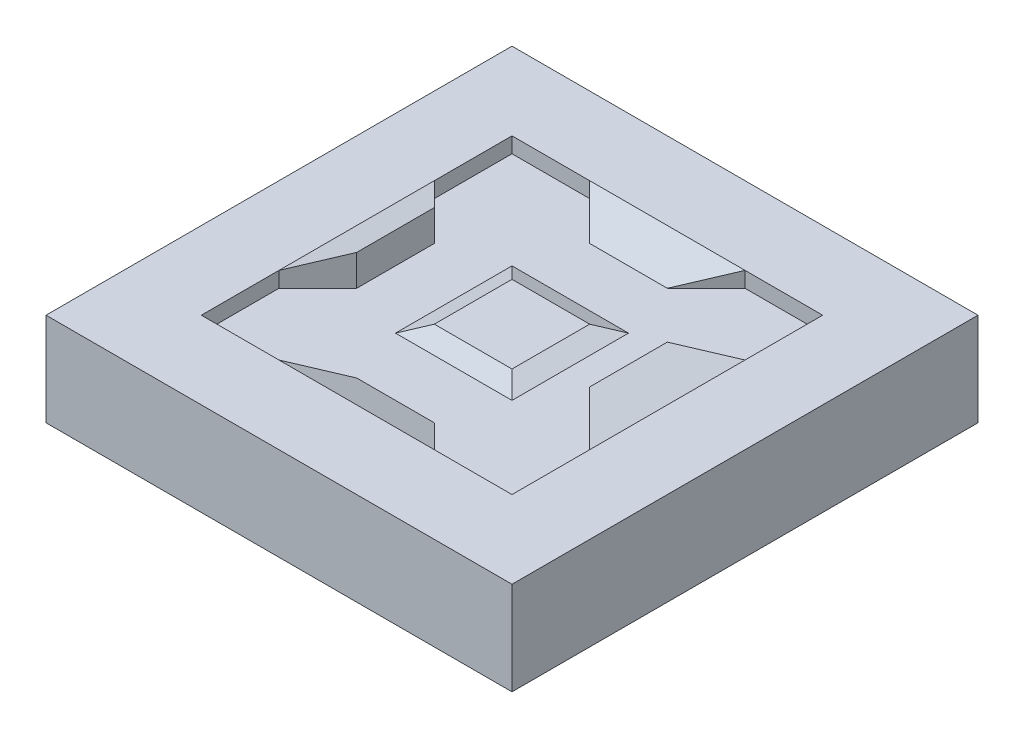
ISO-10303-21;
HEADER;
FILE_DESCRIPTION(('STEP AP214'),'2;1');
FILE_NAME('part.step','',(''),(''),'','','');
FILE_SCHEMA(('AUTOMOTIVE_DESIGN { 1 0 10303 214 1 1 1 1 }'));
ENDSEC;
DATA;
#1=APPLICATION_CONTEXT('core data for automotive mechanical design processes');
#2=APPLICATION_PROTOCOL_DEFINITION('international standard','automotive_design',2000,#1);
#3=PRODUCT_CONTEXT('',#1,'mechanical');
#4=PRODUCT('Part','Part','',(#3));
#5=PRODUCT_RELATED_PRODUCT_CATEGORY('part','',(#4));
#6=PRODUCT_DEFINITION_FORMATION('','',#4);
#7=PRODUCT_DEFINITION_CONTEXT('part definition',#1,'design');
#8=PRODUCT_DEFINITION('design','',#6,#7);
#9=PRODUCT_DEFINITION_SHAPE('','',#8);
#10=(LENGTH_UNIT() NAMED_UNIT(*) SI_UNIT(.MILLI.,.METRE.));
#11=(NAMED_UNIT(*) PLANE_ANGLE_UNIT() SI_UNIT($,.RADIAN.));
#12=(NAMED_UNIT(*) SI_UNIT($,.STERADIAN.) SOLID_ANGLE_UNIT());
#13=UNCERTAINTY_MEASURE_WITH_UNIT(LENGTH_MEASURE(1.E-05),#10,'distance_accuracy_value','');
#14=(GEOMETRIC_REPRESENTATION_CONTEXT(3) GLOBAL_UNCERTAINTY_ASSIGNED_CONTEXT((#13)) GLOBAL_UNIT_ASSIGNED_CONTEXT((#10,
#11,#12)) REPRESENTATION_CONTEXT('',''));
#15=CARTESIAN_POINT('',(0.,0.,0.));
#16=DIRECTION('',(0.,0.,1.));
#17=DIRECTION('',(1.,0.,0.));
#18=AXIS2_PLACEMENT_3D('',#15,#16,#17);
#19=CARTESIAN_POINT('',(762.,203.2,253.999939021253));
#20=DIRECTION('',(0.707106781186539,0.,-0.707106781186556));
#21=DIRECTION('',(-0.707106781186556,0.,-0.707106781186539));
#22=AXIS2_PLACEMENT_3D('',#19,#20,#21);
#23=PLANE('',#22);
#24=DIRECTION('',(0.680413817439779,-0.272165526975912,0.680413817439763));
#25=VECTOR('',#24,1.);
#26=CARTESIAN_POINT('',(762.,203.2,253.999939021253));
#27=LINE('',#26,#25);
#28=CARTESIAN_POINT('',(762.,203.2,253.999939021253));
#29=VERTEX_POINT('',#28);
#30=CARTESIAN_POINT('',(1016.,101.6,507.999939021246));
#31=VERTEX_POINT('',#30);
#32=EDGE_CURVE('E222',#29,#31,#27,.T.);
#33=ORIENTED_EDGE('',*,*,#32,.F.);
#34=DIRECTION('',(0.,-1.,0.));
#35=VECTOR('',#34,1.);
#36=CARTESIAN_POINT('',(762.,203.2,253.999939021253));
#37=LINE('',#36,#35);
#38=CARTESIAN_POINT('',(762.,0.,253.999939021253));
#39=VERTEX_POINT('',#38);
#40=EDGE_CURVE('E412',#29,#39,#37,.T.);
#41=ORIENTED_EDGE('',*,*,#40,.T.);
#42=DIRECTION('',(0.707106781186556,0.,0.707106781186539));
#43=VECTOR('',#42,1.);
#44=CARTESIAN_POINT('',(762.,0.,253.999939021253));
#45=LINE('',#44,#43);
#46=CARTESIAN_POINT('',(1016.,0.,507.999939021247));
#47=VERTEX_POINT('',#46);
#48=EDGE_CURVE('E237',#39,#47,#45,.T.);
#49=ORIENTED_EDGE('',*,*,#48,.T.);
#50=DIRECTION('',(0.,1.,0.));
#51=VECTOR('',#50,1.);
#52=CARTESIAN_POINT('',(1016.,0.,507.999939021246));
#53=LINE('',#52,#51);
#54=EDGE_CURVE('E209',#47,#31,#53,.T.);
#55=ORIENTED_EDGE('',*,*,#54,.T.);
#56=EDGE_LOOP('',(#33,#41,#49,#55));
#57=FACE_BOUND('',#56,.T.);
#58=ADVANCED_FACE('F31',(#57),#23,.F.);
#59=CARTESIAN_POINT('',(762.,203.2,-253.999939021253));
#60=DIRECTION('',(0.707106781186549,0.,0.707106781186546));
#61=DIRECTION('',(0.707106781186546,0.,-0.707106781186549));
#62=AXIS2_PLACEMENT_3D('',#59,#60,#61);
#63=PLANE('',#62);
#64=DIRECTION('',(-0.68041381743977,0.272165526975908,0.680413817439773));
#65=VECTOR('',#64,1.);
#66=CARTESIAN_POINT('',(762.,203.2,-253.999939021253));
#67=LINE('',#66,#65);
#68=CARTESIAN_POINT('',(1016.,101.6,-507.999939021254));
#69=VERTEX_POINT('',#68);
#70=CARTESIAN_POINT('',(762.,203.2,-253.999939021253));
#71=VERTEX_POINT('',#70);
#72=EDGE_CURVE('E231',#69,#71,#67,.T.);
#73=ORIENTED_EDGE('',*,*,#72,.F.);
#74=DIRECTION('',(0.,-1.,0.));
#75=VECTOR('',#74,1.);
#76=CARTESIAN_POINT('',(1016.,0.,-507.999939021253));
#77=LINE('',#76,#75);
#78=CARTESIAN_POINT('',(1016.,0.,-507.999939021253));
#79=VERTEX_POINT('',#78);
#80=EDGE_CURVE('E238',#69,#79,#77,.T.);
#81=ORIENTED_EDGE('',*,*,#80,.T.);
#82=DIRECTION('',(-0.707106781186546,0.,0.707106781186549));
#83=VECTOR('',#82,1.);
#84=CARTESIAN_POINT('',(762.,0.,-253.999939021253));
#85=LINE('',#84,#83);
#86=CARTESIAN_POINT('',(762.,0.,-253.999939021253));
#87=VERTEX_POINT('',#86);
#88=EDGE_CURVE('E404',#79,#87,#85,.T.);
#89=ORIENTED_EDGE('',*,*,#88,.T.);
#90=DIRECTION('',(0.,-1.,0.));
#91=VECTOR('',#90,1.);
#92=CARTESIAN_POINT('',(762.,203.2,-253.999939021253));
#93=LINE('',#92,#91);
#94=EDGE_CURVE('E403',#71,#87,#93,.T.);
#95=ORIENTED_EDGE('',*,*,#94,.F.);
#96=EDGE_LOOP('',(#73,#81,#89,#95));
#97=FACE_BOUND('',#96,.T.);
#98=ADVANCED_FACE('F517',(#97),#63,.F.);
#99=CARTESIAN_POINT('',(-1016.,203.2,-507.999939021253));
#100=DIRECTION('',(-0.707106781186542,0.,0.707106781186553));
#101=DIRECTION('',(0.707106781186553,0.,0.707106781186542));
#102=AXIS2_PLACEMENT_3D('',#99,#100,#101);
#103=PLANE('',#102);
#104=DIRECTION('',(-0.680413817439777,-0.272165526975911,-0.680413817439766));
#105=VECTOR('',#104,1.);
#106=CARTESIAN_POINT('',(-997.185185185185,109.125925925926,-489.185124206438));
#107=LINE('',#106,#105);
#108=CARTESIAN_POINT('',(-762.,203.2,-253.999939021257));
#109=VERTEX_POINT('',#108);
#110=CARTESIAN_POINT('',(-1016.,101.6,-507.999939021253));
#111=VERTEX_POINT('',#110);
#112=EDGE_CURVE('E386',#109,#111,#107,.T.);
#113=ORIENTED_EDGE('',*,*,#112,.F.);
#114=DIRECTION('',(0.,-1.,0.));
#115=VECTOR('',#114,1.);
#116=CARTESIAN_POINT('',(-762.,203.2,-253.999939021257));
#117=LINE('',#116,#115);
#118=CARTESIAN_POINT('',(-762.,0.,-253.999939021257));
#119=VERTEX_POINT('',#118);
#120=EDGE_CURVE('E388',#109,#119,#117,.T.);
#121=ORIENTED_EDGE('',*,*,#120,.T.);
#122=DIRECTION('',(-0.707106781186553,0.,-0.707106781186542));
#123=VECTOR('',#122,1.);
#124=CARTESIAN_POINT('',(-1016.,0.,-507.999939021253));
#125=LINE('',#124,#123);
#126=CARTESIAN_POINT('',(-1016.,0.,-507.999939021253));
#127=VERTEX_POINT('',#126);
#128=EDGE_CURVE('E51',#119,#127,#125,.T.);
#129=ORIENTED_EDGE('',*,*,#128,.T.);
#130=DIRECTION('',(0.,1.,0.));
#131=VECTOR('',#130,1.);
#132=CARTESIAN_POINT('',(-1016.,0.,-507.999939021253));
#133=LINE('',#132,#131);
#134=EDGE_CURVE('E11',#127,#111,#133,.T.);
#135=ORIENTED_EDGE('',*,*,#134,.T.);
#136=EDGE_LOOP('',(#113,#121,#129,#135));
#137=FACE_BOUND('',#136,.T.);
#138=ADVANCED_FACE('F384',(#137),#103,.F.);
#139=CARTESIAN_POINT('',(-762.,203.2,253.999939021253));
#140=DIRECTION('',(-0.707106781186553,0.,-0.707106781186542));
#141=DIRECTION('',(-0.707106781186542,0.,0.707106781186553));
#142=AXIS2_PLACEMENT_3D('',#139,#140,#141);
#143=PLANE('',#142);
#144=DIRECTION('',(0.680413817439766,0.272165526975907,-0.680413817439778));
#145=VECTOR('',#144,1.);
#146=CARTESIAN_POINT('',(-762.,203.2,253.999939021253));
#147=LINE('',#146,#145);
#148=CARTESIAN_POINT('',(-1016.,101.6,507.999939021257));
#149=VERTEX_POINT('',#148);
#150=CARTESIAN_POINT('',(-762.,203.2,253.999939021253));
#151=VERTEX_POINT('',#150);
#152=EDGE_CURVE('E230',#149,#151,#147,.T.);
#153=ORIENTED_EDGE('',*,*,#152,.F.);
#154=DIRECTION('',(0.,-1.,0.));
#155=VECTOR('',#154,1.);
#156=CARTESIAN_POINT('',(-1016.,0.,507.999939021257));
#157=LINE('',#156,#155);
#158=CARTESIAN_POINT('',(-1016.,0.,507.999939021257));
#159=VERTEX_POINT('',#158);
#160=EDGE_CURVE('E39',#149,#159,#157,.T.);
#161=ORIENTED_EDGE('',*,*,#160,.T.);
#162=DIRECTION('',(0.707106781186542,0.,-0.707106781186553));
#163=VECTOR('',#162,1.);
#164=CARTESIAN_POINT('',(-762.,0.,253.999939021253));
#165=LINE('',#164,#163);
#166=CARTESIAN_POINT('',(-762.,0.,253.999939021253));
#167=VERTEX_POINT('',#166);
#168=EDGE_CURVE('E389',#159,#167,#165,.T.);
#169=ORIENTED_EDGE('',*,*,#168,.T.);
#170=DIRECTION('',(0.,-1.,0.));
#171=VECTOR('',#170,1.);
#172=CARTESIAN_POINT('',(-762.,203.2,253.999939021253));
#173=LINE('',#172,#171);
#174=EDGE_CURVE('E398',#151,#167,#173,.T.);
#175=ORIENTED_EDGE('',*,*,#174,.F.);
#176=EDGE_LOOP('',(#153,#161,#169,#175));
#177=FACE_BOUND('',#176,.T.);
#178=ADVANCED_FACE('F565',(#177),#143,.F.);
#179=CARTESIAN_POINT('',(-1016.,0.,1016.));
#180=DIRECTION('',(0.,1.,0.));
#181=DIRECTION('',(0.,0.,1.));
#182=AXIS2_PLACEMENT_3D('',#179,#180,#181);
#183=PLANE('',#182);
#184=DIRECTION('',(1.,0.,0.));
#185=VECTOR('',#184,1.);
#186=CARTESIAN_POINT('',(-381.,0.,381.));
#187=LINE('',#186,#185);
#188=CARTESIAN_POINT('',(-381.,0.,381.));
#189=VERTEX_POINT('',#188);
#190=CARTESIAN_POINT('',(381.,0.,381.));
#191=VERTEX_POINT('',#190);
#192=EDGE_CURVE('E324',#189,#191,#187,.T.);
#193=ORIENTED_EDGE('',*,*,#192,.F.);
#194=DIRECTION('',(0.,0.,1.));
#195=VECTOR('',#194,1.);
#196=CARTESIAN_POINT('',(-381.,0.,-381.));
#197=LINE('',#196,#195);
#198=CARTESIAN_POINT('',(-381.,0.,-381.));
#199=VERTEX_POINT('',#198);
#200=EDGE_CURVE('E277',#199,#189,#197,.T.);
#201=ORIENTED_EDGE('',*,*,#200,.F.);
#202=DIRECTION('',(-1.,0.,0.));
#203=VECTOR('',#202,1.);
#204=CARTESIAN_POINT('',(-381.,0.,-381.));
#205=LINE('',#204,#203);
#206=CARTESIAN_POINT('',(381.,0.,-381.));
#207=VERTEX_POINT('',#206);
#208=EDGE_CURVE('E329',#207,#199,#205,.T.);
#209=ORIENTED_EDGE('',*,*,#208,.F.);
#210=DIRECTION('',(0.,0.,-1.));
#211=VECTOR('',#210,1.);
#212=CARTESIAN_POINT('',(381.,0.,-381.));
#213=LINE('',#212,#211);
#214=EDGE_CURVE('E326',#191,#207,#213,.T.);
#215=ORIENTED_EDGE('',*,*,#214,.F.);
#216=EDGE_LOOP('',(#193,#201,#209,#215));
#217=FACE_BOUND('',#216,.T.);
#218=DIRECTION('',(0.,0.,1.));
#219=VECTOR('',#218,1.);
#220=CARTESIAN_POINT('',(-1016.,0.,-1016.));
#221=LINE('',#220,#219);
#222=CARTESIAN_POINT('',(-1016.,0.,-1016.));
#223=VERTEX_POINT('',#222);
#224=EDGE_CURVE('E351',#223,#127,#221,.T.);
#225=ORIENTED_EDGE('',*,*,#224,.T.);
#226=ORIENTED_EDGE('',*,*,#128,.F.);
#227=DIRECTION('',(0.,0.,-1.));
#228=VECTOR('',#227,1.);
#229=CARTESIAN_POINT('',(-762.,0.,-253.999939021257));
#230=LINE('',#229,#228);
#231=EDGE_CURVE('E46',#167,#119,#230,.T.);
#232=ORIENTED_EDGE('',*,*,#231,.F.);
#233=ORIENTED_EDGE('',*,*,#168,.F.);
#234=CARTESIAN_POINT('',(-1016.,0.,1016.));
#235=VERTEX_POINT('',#234);
#236=EDGE_CURVE('E274',#159,#235,#221,.T.);
#237=ORIENTED_EDGE('',*,*,#236,.T.);
#238=DIRECTION('',(1.,0.,0.));
#239=VECTOR('',#238,1.);
#240=CARTESIAN_POINT('',(-1016.,0.,1016.));
#241=LINE('',#240,#239);
#242=CARTESIAN_POINT('',(-507.999939021248,0.,1016.));
#243=VERTEX_POINT('',#242);
#244=EDGE_CURVE('E354',#235,#243,#241,.T.);
#245=ORIENTED_EDGE('',*,*,#244,.T.);
#246=DIRECTION('',(-0.707106781186541,0.,0.707106781186554));
#247=VECTOR('',#246,1.);
#248=CARTESIAN_POINT('',(-253.999939021253,0.,762.));
#249=LINE('',#248,#247);
#250=CARTESIAN_POINT('',(-253.999939021253,0.,762.));
#251=VERTEX_POINT('',#250);
#252=EDGE_CURVE('E300',#251,#243,#249,.T.);
#253=ORIENTED_EDGE('',*,*,#252,.F.);
#254=DIRECTION('',(-1.,0.,0.));
#255=VECTOR('',#254,1.);
#256=CARTESIAN_POINT('',(-253.999939021253,0.,762.));
#257=LINE('',#256,#255);
#258=CARTESIAN_POINT('',(253.999939021253,0.,762.));
#259=VERTEX_POINT('',#258);
#260=EDGE_CURVE('E436',#259,#251,#257,.T.);
#261=ORIENTED_EDGE('',*,*,#260,.F.);
#262=DIRECTION('',(-0.707106781186554,0.,-0.707106781186541));
#263=VECTOR('',#262,1.);
#264=CARTESIAN_POINT('',(507.999939021257,0.,1016.));
#265=LINE('',#264,#263);
#266=CARTESIAN_POINT('',(507.999939021257,0.,1016.));
#267=VERTEX_POINT('',#266);
#268=EDGE_CURVE('E437',#267,#259,#265,.T.);
#269=ORIENTED_EDGE('',*,*,#268,.F.);
#270=CARTESIAN_POINT('',(1016.,0.,1016.));
#271=VERTEX_POINT('',#270);
#272=EDGE_CURVE('E353',#267,#271,#241,.T.);
#273=ORIENTED_EDGE('',*,*,#272,.T.);
#274=DIRECTION('',(0.,0.,-1.));
#275=VECTOR('',#274,1.);
#276=CARTESIAN_POINT('',(1016.,0.,-1016.));
#277=LINE('',#276,#275);
#278=EDGE_CURVE('E358',#271,#47,#277,.T.);
#279=ORIENTED_EDGE('',*,*,#278,.T.);
#280=ORIENTED_EDGE('',*,*,#48,.F.);
#281=DIRECTION('',(0.,0.,1.));
#282=VECTOR('',#281,1.);
#283=CARTESIAN_POINT('',(762.,0.,253.999939021253));
#284=LINE('',#283,#282);
#285=EDGE_CURVE('E401',#87,#39,#284,.T.);
#286=ORIENTED_EDGE('',*,*,#285,.F.);
#287=ORIENTED_EDGE('',*,*,#88,.F.);
#288=CARTESIAN_POINT('',(1016.,0.,-1016.));
#289=VERTEX_POINT('',#288);
#290=EDGE_CURVE('E357',#79,#289,#277,.T.);
#291=ORIENTED_EDGE('',*,*,#290,.T.);
#292=DIRECTION('',(-1.,0.,0.));
#293=VECTOR('',#292,1.);
#294=CARTESIAN_POINT('',(-1016.,0.,-1016.));
#295=LINE('',#294,#293);
#296=CARTESIAN_POINT('',(507.99993902125,0.,-1016.));
#297=VERTEX_POINT('',#296);
#298=EDGE_CURVE('E360',#289,#297,#295,.T.);
#299=ORIENTED_EDGE('',*,*,#298,.T.);
#300=DIRECTION('',(0.707106781186544,0.,-0.707106781186551));
#301=VECTOR('',#300,1.);
#302=CARTESIAN_POINT('',(253.999939021253,0.,-762.));
#303=LINE('',#302,#301);
#304=CARTESIAN_POINT('',(253.999939021253,0.,-762.));
#305=VERTEX_POINT('',#304);
#306=EDGE_CURVE('E316',#305,#297,#303,.T.);
#307=ORIENTED_EDGE('',*,*,#306,.F.);
#308=DIRECTION('',(1.,0.,0.));
#309=VECTOR('',#308,1.);
#310=CARTESIAN_POINT('',(253.999939021253,0.,-762.));
#311=LINE('',#310,#309);
#312=CARTESIAN_POINT('',(-253.999939021253,0.,-762.));
#313=VERTEX_POINT('',#312);
#314=EDGE_CURVE('E249',#313,#305,#311,.T.);
#315=ORIENTED_EDGE('',*,*,#314,.F.);
#316=DIRECTION('',(0.707106781186551,0.,0.707106781186544));
#317=VECTOR('',#316,1.);
#318=CARTESIAN_POINT('',(-253.999939021253,0.,-762.));
#319=LINE('',#318,#317);
#320=CARTESIAN_POINT('',(-507.999939021255,0.,-1016.));
#321=VERTEX_POINT('',#320);
#322=EDGE_CURVE('E310',#321,#313,#319,.T.);
#323=ORIENTED_EDGE('',*,*,#322,.F.);
#324=EDGE_CURVE('E359',#321,#223,#295,.T.);
#325=ORIENTED_EDGE('',*,*,#324,.T.);
#326=EDGE_LOOP('',(#225,#226,#232,#233,#237,#245,#253,#261,#269,#273,#279,#280,#286,#287,#291,
#299,#307,#315,#323,#325));
#327=FACE_BOUND('',#326,.T.);
#328=ADVANCED_FACE('F369',(#217,#327),#183,.T.);
#329=CARTESIAN_POINT('',(-1016.,0.,-1016.));
#330=DIRECTION('',(-1.,0.,0.));
#331=DIRECTION('',(0.,0.,1.));
#332=AXIS2_PLACEMENT_3D('',#329,#330,#331);
#333=PLANE('',#332);
#334=ORIENTED_EDGE('',*,*,#134,.F.);
#335=ORIENTED_EDGE('',*,*,#224,.F.);
#336=DIRECTION('',(0.,1.,0.));
#337=VECTOR('',#336,1.);
#338=CARTESIAN_POINT('',(-1016.,0.,-1016.));
#339=LINE('',#338,#337);
#340=CARTESIAN_POINT('',(-1016.,101.6,-1016.));
#341=VERTEX_POINT('',#340);
#342=EDGE_CURVE('E265',#223,#341,#339,.T.);
#343=ORIENTED_EDGE('',*,*,#342,.T.);
#344=DIRECTION('',(0.,0.,1.));
#345=VECTOR('',#344,1.);
#346=CARTESIAN_POINT('',(-1016.,101.6,-1016.));
#347=LINE('',#346,#345);
#348=EDGE_CURVE('E259',#341,#111,#347,.T.);
#349=ORIENTED_EDGE('',*,*,#348,.T.);
#350=EDGE_LOOP('',(#334,#335,#343,#349));
#351=FACE_BOUND('',#350,.T.);
#352=ADVANCED_FACE('F380',(#351),#333,.F.);
#353=ORIENTED_EDGE('',*,*,#160,.F.);
#354=CARTESIAN_POINT('',(-1016.,101.6,1016.));
#355=VERTEX_POINT('',#354);
#356=EDGE_CURVE('E334',#149,#355,#347,.T.);
#357=ORIENTED_EDGE('',*,*,#356,.T.);
#358=DIRECTION('',(0.,1.,0.));
#359=VECTOR('',#358,1.);
#360=CARTESIAN_POINT('',(-1016.,0.,1016.));
#361=LINE('',#360,#359);
#362=EDGE_CURVE('E362',#235,#355,#361,.T.);
#363=ORIENTED_EDGE('',*,*,#362,.F.);
#364=ORIENTED_EDGE('',*,*,#236,.F.);
#365=EDGE_LOOP('',(#353,#357,#363,#364));
#366=FACE_BOUND('',#365,.T.);
#367=ADVANCED_FACE('F426',(#366),#333,.F.);
#368=CARTESIAN_POINT('',(1016.,0.,-1016.));
#369=DIRECTION('',(1.,0.,0.));
#370=DIRECTION('',(0.,0.,-1.));
#371=AXIS2_PLACEMENT_3D('',#368,#369,#370);
#372=PLANE('',#371);
#373=ORIENTED_EDGE('',*,*,#54,.F.);
#374=ORIENTED_EDGE('',*,*,#278,.F.);
#375=DIRECTION('',(0.,1.,0.));
#376=VECTOR('',#375,1.);
#377=CARTESIAN_POINT('',(1016.,0.,1016.));
#378=LINE('',#377,#376);
#379=CARTESIAN_POINT('',(1016.,101.6,1016.));
#380=VERTEX_POINT('',#379);
#381=EDGE_CURVE('E212',#271,#380,#378,.T.);
#382=ORIENTED_EDGE('',*,*,#381,.T.);
#383=DIRECTION('',(0.,0.,-1.));
#384=VECTOR('',#383,1.);
#385=CARTESIAN_POINT('',(1016.,101.6,-1016.));
#386=LINE('',#385,#384);
#387=EDGE_CURVE('E204',#380,#31,#386,.T.);
#388=ORIENTED_EDGE('',*,*,#387,.T.);
#389=EDGE_LOOP('',(#373,#374,#382,#388));
#390=FACE_BOUND('',#389,.T.);
#391=ADVANCED_FACE('F206',(#390),#372,.F.);
#392=ORIENTED_EDGE('',*,*,#80,.F.);
#393=CARTESIAN_POINT('',(1016.,101.6,-1016.));
#394=VERTEX_POINT('',#393);
#395=EDGE_CURVE('E219',#69,#394,#386,.T.);
#396=ORIENTED_EDGE('',*,*,#395,.T.);
#397=DIRECTION('',(0.,1.,0.));
#398=VECTOR('',#397,1.);
#399=CARTESIAN_POINT('',(1016.,0.,-1016.));
#400=LINE('',#399,#398);
#401=EDGE_CURVE('E379',#289,#394,#400,.T.);
#402=ORIENTED_EDGE('',*,*,#401,.F.);
#403=ORIENTED_EDGE('',*,*,#290,.F.);
#404=EDGE_LOOP('',(#392,#396,#402,#403));
#405=FACE_BOUND('',#404,.T.);
#406=ADVANCED_FACE('F504',(#405),#372,.F.);
#407=CARTESIAN_POINT('',(-1524.,101.6,1524.));
#408=DIRECTION('',(0.,1.,0.));
#409=DIRECTION('',(0.,0.,1.));
#410=AXIS2_PLACEMENT_3D('',#407,#408,#409);
#411=PLANE('',#410);
#412=DIRECTION('',(0.,0.,1.));
#413=VECTOR('',#412,1.);
#414=CARTESIAN_POINT('',(-1524.,101.6,-1524.));
#415=LINE('',#414,#413);
#416=CARTESIAN_POINT('',(-1524.,101.6,-1524.));
#417=VERTEX_POINT('',#416);
#418=CARTESIAN_POINT('',(-1524.,101.6,1524.));
#419=VERTEX_POINT('',#418);
#420=EDGE_CURVE('E467',#417,#419,#415,.T.);
#421=ORIENTED_EDGE('',*,*,#420,.T.);
#422=DIRECTION('',(1.,0.,0.));
#423=VECTOR('',#422,1.);
#424=CARTESIAN_POINT('',(-1524.,101.6,1524.));
#425=LINE('',#424,#423);
#426=CARTESIAN_POINT('',(1524.,101.6,1524.));
#427=VERTEX_POINT('',#426);
#428=EDGE_CURVE('E470',#419,#427,#425,.T.);
#429=ORIENTED_EDGE('',*,*,#428,.T.);
#430=DIRECTION('',(0.,0.,-1.));
#431=VECTOR('',#430,1.);
#432=CARTESIAN_POINT('',(1524.,101.6,-1524.));
#433=LINE('',#432,#431);
#434=CARTESIAN_POINT('',(1524.,101.6,-1524.));
#435=VERTEX_POINT('',#434);
#436=EDGE_CURVE('E472',#427,#435,#433,.T.);
#437=ORIENTED_EDGE('',*,*,#436,.T.);
#438=DIRECTION('',(-1.,0.,0.));
#439=VECTOR('',#438,1.);
#440=CARTESIAN_POINT('',(-1524.,101.6,-1524.));
#441=LINE('',#440,#439);
#442=EDGE_CURVE('E474',#435,#417,#441,.T.);
#443=ORIENTED_EDGE('',*,*,#442,.T.);
#444=EDGE_LOOP('',(#421,#429,#437,#443));
#445=FACE_BOUND('',#444,.T.);
#446=DIRECTION('',(1.,0.,0.));
#447=VECTOR('',#446,1.);
#448=CARTESIAN_POINT('',(-1016.,101.6,1016.));
#449=LINE('',#448,#447);
#450=CARTESIAN_POINT('',(507.999969510629,101.6,1016.));
#451=VERTEX_POINT('',#450);
#452=EDGE_CURVE('E255',#451,#380,#449,.T.);
#453=ORIENTED_EDGE('',*,*,#452,.F.);
#454=DIRECTION('',(-1.,0.,0.));
#455=VECTOR('',#454,1.);
#456=CARTESIAN_POINT('',(508.,101.6,1016.));
#457=LINE('',#456,#455);
#458=CARTESIAN_POINT('',(-507.999969510624,101.6,1016.));
#459=VERTEX_POINT('',#458);
#460=EDGE_CURVE('E290',#451,#459,#457,.T.);
#461=ORIENTED_EDGE('',*,*,#460,.T.);
#462=EDGE_CURVE('E251',#355,#459,#449,.T.);
#463=ORIENTED_EDGE('',*,*,#462,.F.);
#464=ORIENTED_EDGE('',*,*,#356,.F.);
#465=EDGE_CURVE('E428',#111,#149,#347,.T.);
#466=ORIENTED_EDGE('',*,*,#465,.F.);
#467=ORIENTED_EDGE('',*,*,#348,.F.);
#468=DIRECTION('',(-1.,0.,0.));
#469=VECTOR('',#468,1.);
#470=CARTESIAN_POINT('',(-1016.,101.6,-1016.));
#471=LINE('',#470,#469);
#472=CARTESIAN_POINT('',(-507.999969510628,101.6,-1016.));
#473=VERTEX_POINT('',#472);
#474=EDGE_CURVE('E216',#473,#341,#471,.T.);
#475=ORIENTED_EDGE('',*,*,#474,.F.);
#476=DIRECTION('',(-1.,0.,0.));
#477=VECTOR('',#476,1.);
#478=CARTESIAN_POINT('',(508.,101.6,-1016.));
#479=LINE('',#478,#477);
#480=CARTESIAN_POINT('',(507.999969510625,101.6,-1016.));
#481=VERTEX_POINT('',#480);
#482=EDGE_CURVE('E293',#481,#473,#479,.T.);
#483=ORIENTED_EDGE('',*,*,#482,.F.);
#484=EDGE_CURVE('E271',#394,#481,#471,.T.);
#485=ORIENTED_EDGE('',*,*,#484,.F.);
#486=ORIENTED_EDGE('',*,*,#395,.F.);
#487=EDGE_CURVE('E217',#31,#69,#386,.T.);
#488=ORIENTED_EDGE('',*,*,#487,.F.);
#489=ORIENTED_EDGE('',*,*,#387,.F.);
#490=EDGE_LOOP('',(#453,#461,#463,#464,#466,#467,#475,#483,#485,#486,#488,#489));
#491=FACE_BOUND('',#490,.T.);
#492=ADVANCED_FACE('F234',(#445,#491),#411,.T.);
#493=CARTESIAN_POINT('',(-253.999939021253,101.6,762.));
#494=DIRECTION('',(0.707106781186554,0.,0.707106781186541));
#495=DIRECTION('',(0.707106781186541,0.,-0.707106781186554));
#496=AXIS2_PLACEMENT_3D('',#493,#494,#495);
#497=PLANE('',#496);
#498=DIRECTION('',(-0.680413817439765,0.272165526975911,0.680413817439777));
#499=VECTOR('',#498,1.);
#500=CARTESIAN_POINT('',(-272.814753836067,7.52592592592605,780.814814814815));
#501=LINE('',#500,#499);
#502=EDGE_CURVE('E289',#251,#459,#501,.T.);
#503=ORIENTED_EDGE('',*,*,#502,.F.);
#504=ORIENTED_EDGE('',*,*,#252,.T.);
#505=DIRECTION('',(0.,-1.,0.));
#506=VECTOR('',#505,1.);
#507=CARTESIAN_POINT('',(-507.999939021248,101.6,1016.));
#508=LINE('',#507,#506);
#509=EDGE_CURVE('E247',#459,#243,#508,.T.);
#510=ORIENTED_EDGE('',*,*,#509,.F.);
#511=EDGE_LOOP('',(#503,#504,#510));
#512=FACE_BOUND('',#511,.T.);
#513=ADVANCED_FACE('F503',(#512),#497,.F.);
#514=CARTESIAN_POINT('',(507.999939021257,101.6,1016.));
#515=DIRECTION('',(-0.707106781186541,0.,0.707106781186554));
#516=DIRECTION('',(0.707106781186554,0.,0.707106781186541));
#517=AXIS2_PLACEMENT_3D('',#514,#515,#516);
#518=PLANE('',#517);
#519=DIRECTION('',(-0.680413817439778,-0.272165526975906,-0.680413817439766));
#520=VECTOR('',#519,1.);
#521=CARTESIAN_POINT('',(507.999939021257,101.6,1016.));
#522=LINE('',#521,#520);
#523=EDGE_CURVE('E286',#451,#259,#522,.T.);
#524=ORIENTED_EDGE('',*,*,#523,.F.);
#525=DIRECTION('',(0.,-1.,0.));
#526=VECTOR('',#525,1.);
#527=CARTESIAN_POINT('',(507.999939021257,101.6,1016.));
#528=LINE('',#527,#526);
#529=EDGE_CURVE('E250',#451,#267,#528,.T.);
#530=ORIENTED_EDGE('',*,*,#529,.T.);
#531=ORIENTED_EDGE('',*,*,#268,.T.);
#532=EDGE_LOOP('',(#524,#530,#531));
#533=FACE_BOUND('',#532,.T.);
#534=ADVANCED_FACE('F510',(#533),#518,.F.);
#535=CARTESIAN_POINT('',(253.999939021253,101.6,-762.));
#536=DIRECTION('',(-0.707106781186551,0.,-0.707106781186544));
#537=DIRECTION('',(-0.707106781186544,0.,0.707106781186551));
#538=AXIS2_PLACEMENT_3D('',#535,#536,#537);
#539=PLANE('',#538);
#540=DIRECTION('',(0.680413817439768,0.27216552697591,-0.680413817439775));
#541=VECTOR('',#540,1.);
#542=CARTESIAN_POINT('',(272.814753836067,7.52592592592601,-780.814814814815));
#543=LINE('',#542,#541);
#544=EDGE_CURVE('E297',#305,#481,#543,.T.);
#545=ORIENTED_EDGE('',*,*,#544,.F.);
#546=ORIENTED_EDGE('',*,*,#306,.T.);
#547=DIRECTION('',(0.,-1.,0.));
#548=VECTOR('',#547,1.);
#549=CARTESIAN_POINT('',(507.99993902125,101.6,-1016.));
#550=LINE('',#549,#548);
#551=EDGE_CURVE('E275',#481,#297,#550,.T.);
#552=ORIENTED_EDGE('',*,*,#551,.F.);
#553=EDGE_LOOP('',(#545,#546,#552));
#554=FACE_BOUND('',#553,.T.);
#555=ADVANCED_FACE('F447',(#554),#539,.F.);
#556=CARTESIAN_POINT('',(-253.999939021253,101.6,-762.));
#557=DIRECTION('',(0.707106781186544,0.,-0.707106781186551));
#558=DIRECTION('',(-0.707106781186551,0.,-0.707106781186544));
#559=AXIS2_PLACEMENT_3D('',#556,#557,#558);
#560=PLANE('',#559);
#561=DIRECTION('',(0.680413817439776,-0.272165526975907,0.680413817439768));
#562=VECTOR('',#561,1.);
#563=CARTESIAN_POINT('',(-272.814753836067,7.52592592592585,-780.814814814815));
#564=LINE('',#563,#562);
#565=EDGE_CURVE('E242',#473,#313,#564,.T.);
#566=ORIENTED_EDGE('',*,*,#565,.F.);
#567=DIRECTION('',(0.,-1.,0.));
#568=VECTOR('',#567,1.);
#569=CARTESIAN_POINT('',(-507.999939021255,101.6,-1016.));
#570=LINE('',#569,#568);
#571=EDGE_CURVE('E278',#473,#321,#570,.T.);
#572=ORIENTED_EDGE('',*,*,#571,.T.);
#573=ORIENTED_EDGE('',*,*,#322,.T.);
#574=EDGE_LOOP('',(#566,#572,#573));
#575=FACE_BOUND('',#574,.T.);
#576=ADVANCED_FACE('F539',(#575),#560,.F.);
#577=CARTESIAN_POINT('',(-1016.,0.,1016.));
#578=DIRECTION('',(0.,0.,1.));
#579=DIRECTION('',(1.,0.,0.));
#580=AXIS2_PLACEMENT_3D('',#577,#578,#579);
#581=PLANE('',#580);
#582=ORIENTED_EDGE('',*,*,#509,.T.);
#583=ORIENTED_EDGE('',*,*,#244,.F.);
#584=ORIENTED_EDGE('',*,*,#362,.T.);
#585=ORIENTED_EDGE('',*,*,#462,.T.);
#586=EDGE_LOOP('',(#582,#583,#584,#585));
#587=FACE_BOUND('',#586,.T.);
#588=ADVANCED_FACE('F420',(#587),#581,.F.);
#589=ORIENTED_EDGE('',*,*,#529,.F.);
#590=ORIENTED_EDGE('',*,*,#452,.T.);
#591=ORIENTED_EDGE('',*,*,#381,.F.);
#592=ORIENTED_EDGE('',*,*,#272,.F.);
#593=EDGE_LOOP('',(#589,#590,#591,#592));
#594=FACE_BOUND('',#593,.T.);
#595=ADVANCED_FACE('F431',(#594),#581,.F.);
#596=CARTESIAN_POINT('',(-1016.,0.,-1016.));
#597=DIRECTION('',(0.,0.,-1.));
#598=DIRECTION('',(-1.,0.,0.));
#599=AXIS2_PLACEMENT_3D('',#596,#597,#598);
#600=PLANE('',#599);
#601=ORIENTED_EDGE('',*,*,#551,.T.);
#602=ORIENTED_EDGE('',*,*,#298,.F.);
#603=ORIENTED_EDGE('',*,*,#401,.T.);
#604=ORIENTED_EDGE('',*,*,#484,.T.);
#605=EDGE_LOOP('',(#601,#602,#603,#604));
#606=FACE_BOUND('',#605,.T.);
#607=ADVANCED_FACE('F451',(#606),#600,.F.);
#608=ORIENTED_EDGE('',*,*,#571,.F.);
#609=ORIENTED_EDGE('',*,*,#474,.T.);
#610=ORIENTED_EDGE('',*,*,#342,.F.);
#611=ORIENTED_EDGE('',*,*,#324,.F.);
#612=EDGE_LOOP('',(#608,#609,#610,#611));
#613=FACE_BOUND('',#612,.T.);
#614=ADVANCED_FACE('F374',(#613),#600,.F.);
#615=CARTESIAN_POINT('',(-1524.,101.6,-1524.));
#616=DIRECTION('',(1.,0.,0.));
#617=DIRECTION('',(0.,0.,-1.));
#618=AXIS2_PLACEMENT_3D('',#615,#616,#617);
#619=PLANE('',#618);
#620=DIRECTION('',(0.,-1.,0.));
#621=VECTOR('',#620,1.);
#622=CARTESIAN_POINT('',(-1524.,101.6,-1524.));
#623=LINE('',#622,#621);
#624=CARTESIAN_POINT('',(-1524.,-508.,-1524.));
#625=VERTEX_POINT('',#624);
#626=EDGE_CURVE('E476',#417,#625,#623,.T.);
#627=ORIENTED_EDGE('',*,*,#626,.T.);
#628=DIRECTION('',(0.,0.,1.));
#629=VECTOR('',#628,1.);
#630=CARTESIAN_POINT('',(-1524.,-508.,-1524.));
#631=LINE('',#630,#629);
#632=CARTESIAN_POINT('',(-1524.,-508.,1524.));
#633=VERTEX_POINT('',#632);
#634=EDGE_CURVE('E378',#625,#633,#631,.T.);
#635=ORIENTED_EDGE('',*,*,#634,.T.);
#636=DIRECTION('',(0.,-1.,0.));
#637=VECTOR('',#636,1.);
#638=CARTESIAN_POINT('',(-1524.,101.6,1524.));
#639=LINE('',#638,#637);
#640=EDGE_CURVE('E308',#419,#633,#639,.T.);
#641=ORIENTED_EDGE('',*,*,#640,.F.);
#642=ORIENTED_EDGE('',*,*,#420,.F.);
#643=EDGE_LOOP('',(#627,#635,#641,#642));
#644=FACE_BOUND('',#643,.T.);
#645=ADVANCED_FACE('F33',(#644),#619,.F.);
#646=CARTESIAN_POINT('',(-1524.,101.6,1524.));
#647=DIRECTION('',(0.,0.,-1.));
#648=DIRECTION('',(-1.,0.,0.));
#649=AXIS2_PLACEMENT_3D('',#646,#647,#648);
#650=PLANE('',#649);
#651=ORIENTED_EDGE('',*,*,#640,.T.);
#652=DIRECTION('',(1.,0.,0.));
#653=VECTOR('',#652,1.);
#654=CARTESIAN_POINT('',(-1524.,-508.,1524.));
#655=LINE('',#654,#653);
#656=CARTESIAN_POINT('',(1524.,-508.,1524.));
#657=VERTEX_POINT('',#656);
#658=EDGE_CURVE('E458',#633,#657,#655,.T.);
#659=ORIENTED_EDGE('',*,*,#658,.T.);
#660=DIRECTION('',(0.,-1.,0.));
#661=VECTOR('',#660,1.);
#662=CARTESIAN_POINT('',(1524.,101.6,1524.));
#663=LINE('',#662,#661);
#664=EDGE_CURVE('E480',#427,#657,#663,.T.);
#665=ORIENTED_EDGE('',*,*,#664,.F.);
#666=ORIENTED_EDGE('',*,*,#428,.F.);
#667=EDGE_LOOP('',(#651,#659,#665,#666));
#668=FACE_BOUND('',#667,.T.);
#669=ADVANCED_FACE('F484',(#668),#650,.F.);
#670=CARTESIAN_POINT('',(1524.,101.6,-1524.));
#671=DIRECTION('',(-1.,0.,0.));
#672=DIRECTION('',(0.,0.,1.));
#673=AXIS2_PLACEMENT_3D('',#670,#671,#672);
#674=PLANE('',#673);
#675=ORIENTED_EDGE('',*,*,#664,.T.);
#676=DIRECTION('',(0.,0.,-1.));
#677=VECTOR('',#676,1.);
#678=CARTESIAN_POINT('',(1524.,-508.,-1524.));
#679=LINE('',#678,#677);
#680=CARTESIAN_POINT('',(1524.,-508.,-1524.));
#681=VERTEX_POINT('',#680);
#682=EDGE_CURVE('E461',#657,#681,#679,.T.);
#683=ORIENTED_EDGE('',*,*,#682,.T.);
#684=DIRECTION('',(0.,-1.,0.));
#685=VECTOR('',#684,1.);
#686=CARTESIAN_POINT('',(1524.,101.6,-1524.));
#687=LINE('',#686,#685);
#688=EDGE_CURVE('E478',#435,#681,#687,.T.);
#689=ORIENTED_EDGE('',*,*,#688,.F.);
#690=ORIENTED_EDGE('',*,*,#436,.F.);
#691=EDGE_LOOP('',(#675,#683,#689,#690));
#692=FACE_BOUND('',#691,.T.);
#693=ADVANCED_FACE('F500',(#692),#674,.F.);
#694=CARTESIAN_POINT('',(-1524.,101.6,-1524.));
#695=DIRECTION('',(0.,0.,1.));
#696=DIRECTION('',(1.,0.,0.));
#697=AXIS2_PLACEMENT_3D('',#694,#695,#696);
#698=PLANE('',#697);
#699=ORIENTED_EDGE('',*,*,#688,.T.);
#700=DIRECTION('',(-1.,0.,0.));
#701=VECTOR('',#700,1.);
#702=CARTESIAN_POINT('',(-1524.,-508.,-1524.));
#703=LINE('',#702,#701);
#704=EDGE_CURVE('E464',#681,#625,#703,.T.);
#705=ORIENTED_EDGE('',*,*,#704,.T.);
#706=ORIENTED_EDGE('',*,*,#626,.F.);
#707=ORIENTED_EDGE('',*,*,#442,.F.);
#708=EDGE_LOOP('',(#699,#705,#706,#707));
#709=FACE_BOUND('',#708,.T.);
#710=ADVANCED_FACE('F496',(#709),#698,.F.);
#711=CARTESIAN_POINT('',(-1524.,-508.,1524.));
#712=DIRECTION('',(0.,1.,0.));
#713=DIRECTION('',(0.,0.,1.));
#714=AXIS2_PLACEMENT_3D('',#711,#712,#713);
#715=PLANE('',#714);
#716=ORIENTED_EDGE('',*,*,#634,.F.);
#717=ORIENTED_EDGE('',*,*,#704,.F.);
#718=ORIENTED_EDGE('',*,*,#682,.F.);
#719=ORIENTED_EDGE('',*,*,#658,.F.);
#720=EDGE_LOOP('',(#716,#717,#718,#719));
#721=FACE_BOUND('',#720,.T.);
#722=ADVANCED_FACE('F491',(#721),#715,.F.);
#723=CARTESIAN_POINT('',(-381.,0.,-381.));
#724=DIRECTION('',(-0.371390522628,0.928476752375686,0.));
#725=DIRECTION('',(-0.928476752375686,-0.371390522628,0.));
#726=AXIS2_PLACEMENT_3D('',#723,#724,#725);
#727=PLANE('',#726);
#728=ORIENTED_EDGE('',*,*,#200,.T.);
#729=DIRECTION('',(-0.680413841639687,-0.272165405976303,0.680413841639687));
#730=VECTOR('',#729,1.);
#731=CARTESIAN_POINT('',(-381.,0.,381.));
#732=LINE('',#731,#730);
#733=CARTESIAN_POINT('',(-253.999939021253,50.8,253.999939021253));
#734=VERTEX_POINT('',#733);
#735=EDGE_CURVE('E332',#734,#189,#732,.T.);
#736=ORIENTED_EDGE('',*,*,#735,.F.);
#737=DIRECTION('',(0.,0.,-1.));
#738=VECTOR('',#737,1.);
#739=CARTESIAN_POINT('',(-253.999939021253,50.8,-381.));
#740=LINE('',#739,#738);
#741=CARTESIAN_POINT('',(-253.999939021253,50.8,-253.999939021253));
#742=VERTEX_POINT('',#741);
#743=EDGE_CURVE('E331',#742,#734,#740,.F.);
#744=ORIENTED_EDGE('',*,*,#743,.F.);
#745=DIRECTION('',(-0.680413841639687,-0.272165405976303,-0.680413841639687));
#746=VECTOR('',#745,1.);
#747=CARTESIAN_POINT('',(-381.,0.,-381.));
#748=LINE('',#747,#746);
#749=EDGE_CURVE('E336',#742,#199,#748,.T.);
#750=ORIENTED_EDGE('',*,*,#749,.T.);
#751=EDGE_LOOP('',(#728,#736,#744,#750));
#752=FACE_BOUND('',#751,.T.);
#753=ADVANCED_FACE('F548',(#752),#727,.T.);
#754=CARTESIAN_POINT('',(-381.,0.,381.));
#755=DIRECTION('',(0.,0.928476752375686,0.371390522628));
#756=DIRECTION('',(0.,-0.371390522628,0.928476752375686));
#757=AXIS2_PLACEMENT_3D('',#754,#755,#756);
#758=PLANE('',#757);
#759=ORIENTED_EDGE('',*,*,#192,.T.);
#760=DIRECTION('',(0.680413841639687,-0.272165405976303,0.680413841639687));
#761=VECTOR('',#760,1.);
#762=CARTESIAN_POINT('',(28.2221971281038,141.111053394622,28.2221971281038));
#763=LINE('',#762,#761);
#764=CARTESIAN_POINT('',(253.999939021253,50.8,253.999939021253));
#765=VERTEX_POINT('',#764);
#766=EDGE_CURVE('E335',#765,#191,#763,.T.);
#767=ORIENTED_EDGE('',*,*,#766,.F.);
#768=DIRECTION('',(-1.,0.,0.));
#769=VECTOR('',#768,1.);
#770=CARTESIAN_POINT('',(-381.,50.8,253.999939021253));
#771=LINE('',#770,#769);
#772=EDGE_CURVE('E346',#734,#765,#771,.F.);
#773=ORIENTED_EDGE('',*,*,#772,.F.);
#774=ORIENTED_EDGE('',*,*,#735,.T.);
#775=EDGE_LOOP('',(#759,#767,#773,#774));
#776=FACE_BOUND('',#775,.T.);
#777=ADVANCED_FACE('F551',(#776),#758,.T.);
#778=CARTESIAN_POINT('',(381.,0.,-381.));
#779=DIRECTION('',(0.371390522628,0.928476752375686,0.));
#780=DIRECTION('',(-0.928476752375686,0.371390522628,0.));
#781=AXIS2_PLACEMENT_3D('',#778,#779,#780);
#782=PLANE('',#781);
#783=ORIENTED_EDGE('',*,*,#214,.T.);
#784=DIRECTION('',(0.680413841639687,-0.272165405976303,-0.680413841639687));
#785=VECTOR('',#784,1.);
#786=CARTESIAN_POINT('',(28.2221971281038,141.111053394622,-28.2221971281038));
#787=LINE('',#786,#785);
#788=CARTESIAN_POINT('',(253.999939021253,50.8,-253.999939021253));
#789=VERTEX_POINT('',#788);
#790=EDGE_CURVE('E339',#789,#207,#787,.T.);
#791=ORIENTED_EDGE('',*,*,#790,.F.);
#792=DIRECTION('',(0.,0.,1.));
#793=VECTOR('',#792,1.);
#794=CARTESIAN_POINT('',(253.999939021253,50.8,-381.));
#795=LINE('',#794,#793);
#796=EDGE_CURVE('E348',#765,#789,#795,.F.);
#797=ORIENTED_EDGE('',*,*,#796,.F.);
#798=ORIENTED_EDGE('',*,*,#766,.T.);
#799=EDGE_LOOP('',(#783,#791,#797,#798));
#800=FACE_BOUND('',#799,.T.);
#801=ADVANCED_FACE('F555',(#800),#782,.T.);
#802=CARTESIAN_POINT('',(-381.,0.,-381.));
#803=DIRECTION('',(0.,0.928476752375686,-0.371390522628));
#804=DIRECTION('',(0.,0.371390522628,0.928476752375686));
#805=AXIS2_PLACEMENT_3D('',#802,#803,#804);
#806=PLANE('',#805);
#807=ORIENTED_EDGE('',*,*,#208,.T.);
#808=ORIENTED_EDGE('',*,*,#749,.F.);
#809=DIRECTION('',(1.,0.,0.));
#810=VECTOR('',#809,1.);
#811=CARTESIAN_POINT('',(-381.,50.8,-253.999939021253));
#812=LINE('',#811,#810);
#813=EDGE_CURVE('E340',#789,#742,#812,.F.);
#814=ORIENTED_EDGE('',*,*,#813,.F.);
#815=ORIENTED_EDGE('',*,*,#790,.T.);
#816=EDGE_LOOP('',(#807,#808,#814,#815));
#817=FACE_BOUND('',#816,.T.);
#818=ADVANCED_FACE('F546',(#817),#806,.T.);
#819=CARTESIAN_POINT('',(-381.,50.8,381.));
#820=DIRECTION('',(0.,1.,0.));
#821=DIRECTION('',(0.,0.,1.));
#822=AXIS2_PLACEMENT_3D('',#819,#820,#821);
#823=PLANE('',#822);
#824=ORIENTED_EDGE('',*,*,#743,.T.);
#825=ORIENTED_EDGE('',*,*,#772,.T.);
#826=ORIENTED_EDGE('',*,*,#796,.T.);
#827=ORIENTED_EDGE('',*,*,#813,.T.);
#828=EDGE_LOOP('',(#824,#825,#826,#827));
#829=FACE_BOUND('',#828,.T.);
#830=ADVANCED_FACE('F536',(#829),#823,.T.);
#831=CARTESIAN_POINT('',(508.,0.,-762.));
#832=DIRECTION('',(0.,0.928476690885259,0.371390676354104));
#833=DIRECTION('',(0.,-0.371390676354104,0.928476690885259));
#834=AXIS2_PLACEMENT_3D('',#831,#832,#833);
#835=PLANE('',#834);
#836=ORIENTED_EDGE('',*,*,#544,.T.);
#837=ORIENTED_EDGE('',*,*,#482,.T.);
#838=ORIENTED_EDGE('',*,*,#565,.T.);
#839=ORIENTED_EDGE('',*,*,#314,.T.);
#840=EDGE_LOOP('',(#836,#837,#838,#839));
#841=FACE_BOUND('',#840,.T.);
#842=ADVANCED_FACE('F444',(#841),#835,.T.);
#843=CARTESIAN_POINT('',(508.,101.6,1016.));
#844=DIRECTION('',(0.,0.928476690885259,-0.371390676354104));
#845=DIRECTION('',(0.,0.371390676354104,0.928476690885259));
#846=AXIS2_PLACEMENT_3D('',#843,#844,#845);
#847=PLANE('',#846);
#848=ORIENTED_EDGE('',*,*,#502,.T.);
#849=ORIENTED_EDGE('',*,*,#460,.F.);
#850=ORIENTED_EDGE('',*,*,#523,.T.);
#851=ORIENTED_EDGE('',*,*,#260,.T.);
#852=EDGE_LOOP('',(#848,#849,#850,#851));
#853=FACE_BOUND('',#852,.T.);
#854=ADVANCED_FACE('F530',(#853),#847,.T.);
#855=CARTESIAN_POINT('',(762.,203.2,253.999939021253));
#856=DIRECTION('',(1.,0.,0.));
#857=DIRECTION('',(0.,0.,-1.));
#858=AXIS2_PLACEMENT_3D('',#855,#856,#857);
#859=PLANE('',#858);
#860=ORIENTED_EDGE('',*,*,#285,.T.);
#861=ORIENTED_EDGE('',*,*,#40,.F.);
#862=DIRECTION('',(0.,0.,1.));
#863=VECTOR('',#862,1.);
#864=CARTESIAN_POINT('',(762.,203.2,253.999939021253));
#865=LINE('',#864,#863);
#866=EDGE_CURVE('E226',#71,#29,#865,.T.);
#867=ORIENTED_EDGE('',*,*,#866,.F.);
#868=ORIENTED_EDGE('',*,*,#94,.T.);
#869=EDGE_LOOP('',(#860,#861,#867,#868));
#870=FACE_BOUND('',#869,.T.);
#871=ADVANCED_FACE('F526',(#870),#859,.F.);
#872=CARTESIAN_POINT('',(-762.,203.2,-253.999939021257));
#873=DIRECTION('',(-1.,0.,0.));
#874=DIRECTION('',(0.,0.,1.));
#875=AXIS2_PLACEMENT_3D('',#872,#873,#874);
#876=PLANE('',#875);
#877=ORIENTED_EDGE('',*,*,#231,.T.);
#878=ORIENTED_EDGE('',*,*,#120,.F.);
#879=DIRECTION('',(0.,0.,-1.));
#880=VECTOR('',#879,1.);
#881=CARTESIAN_POINT('',(-762.,203.2,-253.999939021257));
#882=LINE('',#881,#880);
#883=EDGE_CURVE('E394',#151,#109,#882,.T.);
#884=ORIENTED_EDGE('',*,*,#883,.F.);
#885=ORIENTED_EDGE('',*,*,#174,.T.);
#886=EDGE_LOOP('',(#877,#878,#884,#885));
#887=FACE_BOUND('',#886,.T.);
#888=ADVANCED_FACE('F529',(#887),#876,.F.);
#889=CARTESIAN_POINT('',(-1016.,101.6,508.));
#890=DIRECTION('',(-0.371390676354104,0.928476690885259,0.));
#891=DIRECTION('',(-0.928476690885259,-0.371390676354104,0.));
#892=AXIS2_PLACEMENT_3D('',#889,#890,#891);
#893=PLANE('',#892);
#894=ORIENTED_EDGE('',*,*,#112,.T.);
#895=ORIENTED_EDGE('',*,*,#465,.T.);
#896=ORIENTED_EDGE('',*,*,#152,.T.);
#897=ORIENTED_EDGE('',*,*,#883,.T.);
#898=EDGE_LOOP('',(#894,#895,#896,#897));
#899=FACE_BOUND('',#898,.T.);
#900=ADVANCED_FACE('F693',(#899),#893,.T.);
#901=CARTESIAN_POINT('',(1016.,101.6,508.));
#902=DIRECTION('',(0.371390676354104,0.928476690885259,0.));
#903=DIRECTION('',(-0.928476690885259,0.371390676354104,0.));
#904=AXIS2_PLACEMENT_3D('',#901,#902,#903);
#905=PLANE('',#904);
#906=ORIENTED_EDGE('',*,*,#32,.T.);
#907=ORIENTED_EDGE('',*,*,#487,.T.);
#908=ORIENTED_EDGE('',*,*,#72,.T.);
#909=ORIENTED_EDGE('',*,*,#866,.T.);
#910=EDGE_LOOP('',(#906,#907,#908,#909));
#911=FACE_BOUND('',#910,.T.);
#912=ADVANCED_FACE('F223',(#911),#905,.T.);
#913=CLOSED_SHELL('',(#58,#98,#138,#178,#328,#352,#367,#391,#406,#492,#513,#534,#555,#576,#588,
#595,#607,#614,#645,#669,#693,#710,#722,#753,#777,#801,#818,#830,#842,#854,#871,#888,#900,#912));
#914=MANIFOLD_SOLID_BREP('B2',#913);
#915=ADVANCED_BREP_SHAPE_REPRESENTATION('',(#18,#914),#14);
#916=SHAPE_DEFINITION_REPRESENTATION(#9,#915);
ENDSEC;
END-ISO-10303-21;
